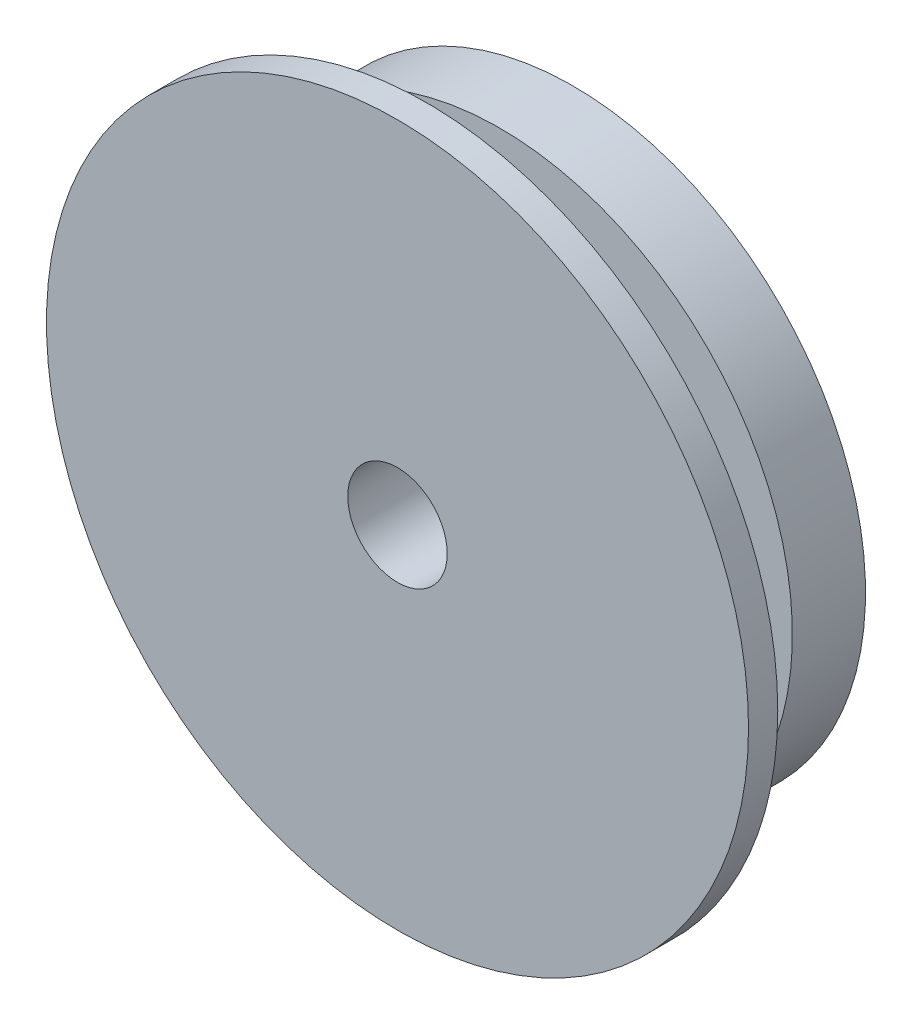
ISO-10303-21;
HEADER;
FILE_DESCRIPTION(('STEP AP214'),'2;1');
FILE_NAME('part.step','',(''),(''),'','','');
FILE_SCHEMA(('AUTOMOTIVE_DESIGN { 1 0 10303 214 1 1 1 1 }'));
ENDSEC;
DATA;
#1=APPLICATION_CONTEXT('core data for automotive mechanical design processes');
#2=APPLICATION_PROTOCOL_DEFINITION('international standard','automotive_design',2000,#1);
#3=PRODUCT_CONTEXT('',#1,'mechanical');
#4=PRODUCT('Part','Part','',(#3));
#5=PRODUCT_RELATED_PRODUCT_CATEGORY('part','',(#4));
#6=PRODUCT_DEFINITION_FORMATION('','',#4);
#7=PRODUCT_DEFINITION_CONTEXT('part definition',#1,'design');
#8=PRODUCT_DEFINITION('design','',#6,#7);
#9=PRODUCT_DEFINITION_SHAPE('','',#8);
#10=(LENGTH_UNIT() NAMED_UNIT(*) SI_UNIT(.MILLI.,.METRE.));
#11=(NAMED_UNIT(*) PLANE_ANGLE_UNIT() SI_UNIT($,.RADIAN.));
#12=(NAMED_UNIT(*) SI_UNIT($,.STERADIAN.) SOLID_ANGLE_UNIT());
#13=UNCERTAINTY_MEASURE_WITH_UNIT(LENGTH_MEASURE(1.E-05),#10,'distance_accuracy_value','');
#14=(GEOMETRIC_REPRESENTATION_CONTEXT(3) GLOBAL_UNCERTAINTY_ASSIGNED_CONTEXT((#13)) GLOBAL_UNIT_ASSIGNED_CONTEXT((#10,
#11,#12)) REPRESENTATION_CONTEXT('',''));
#15=CARTESIAN_POINT('',(0.,0.,0.));
#16=DIRECTION('',(0.,0.,1.));
#17=DIRECTION('',(1.,0.,0.));
#18=AXIS2_PLACEMENT_3D('',#15,#16,#17);
#19=CARTESIAN_POINT('',(0.,0.,16.5));
#20=DIRECTION('',(0.,0.,-1.));
#21=DIRECTION('',(-1.,0.,0.));
#22=AXIS2_PLACEMENT_3D('',#19,#20,#21);
#23=CYLINDRICAL_SURFACE('',#22,25.);
#24=CARTESIAN_POINT('',(0.,0.,7.75));
#25=DIRECTION('',(0.,0.,-1.));
#26=DIRECTION('',(-1.,0.,0.));
#27=AXIS2_PLACEMENT_3D('',#24,#25,#26);
#28=CIRCLE('',#27,25.);
#29=CARTESIAN_POINT('',(-25.,0.,7.75));
#30=VERTEX_POINT('',#29);
#31=EDGE_CURVE('E97',#30,#30,#28,.T.);
#32=ORIENTED_EDGE('',*,*,#31,.T.);
#33=EDGE_LOOP('',(#32));
#34=FACE_BOUND('',#33,.T.);
#35=CARTESIAN_POINT('',(0.,0.,1.5));
#36=DIRECTION('',(0.,0.,-1.));
#37=DIRECTION('',(-1.,0.,0.));
#38=AXIS2_PLACEMENT_3D('',#35,#36,#37);
#39=CIRCLE('',#38,25.);
#40=CARTESIAN_POINT('',(-25.,0.,1.5));
#41=VERTEX_POINT('',#40);
#42=EDGE_CURVE('E83',#41,#41,#39,.T.);
#43=ORIENTED_EDGE('',*,*,#42,.F.);
#44=EDGE_LOOP('',(#43));
#45=FACE_BOUND('',#44,.T.);
#46=ADVANCED_FACE('F39',(#34,#45),#23,.T.);
#47=CARTESIAN_POINT('',(0.,0.,0.));
#48=DIRECTION('',(0.,0.,1.));
#49=DIRECTION('',(1.,0.,0.));
#50=AXIS2_PLACEMENT_3D('',#47,#48,#49);
#51=PLANE('',#50);
#52=CARTESIAN_POINT('',(0.,0.,0.));
#53=DIRECTION('',(0.,0.,1.));
#54=DIRECTION('',(1.,0.,0.));
#55=AXIS2_PLACEMENT_3D('',#52,#53,#54);
#56=CIRCLE('',#55,6.1);
#57=CARTESIAN_POINT('',(6.1,0.,0.));
#58=VERTEX_POINT('',#57);
#59=EDGE_CURVE('E10',#58,#58,#56,.F.);
#60=ORIENTED_EDGE('',*,*,#59,.F.);
#61=EDGE_LOOP('',(#60));
#62=FACE_BOUND('',#61,.T.);
#63=CARTESIAN_POINT('',(0.,0.,0.));
#64=DIRECTION('',(0.,0.,-1.));
#65=DIRECTION('',(-1.,0.,0.));
#66=AXIS2_PLACEMENT_3D('',#63,#64,#65);
#67=CIRCLE('',#66,15.);
#68=CARTESIAN_POINT('',(-15.,0.,0.));
#69=VERTEX_POINT('',#68);
#70=EDGE_CURVE('E59',#69,#69,#67,.T.);
#71=ORIENTED_EDGE('',*,*,#70,.T.);
#72=EDGE_LOOP('',(#71));
#73=FACE_BOUND('',#72,.T.);
#74=ADVANCED_FACE('F129',(#62,#73),#51,.F.);
#75=CARTESIAN_POINT('',(0.,0.,14.));
#76=DIRECTION('',(0.,0.,1.));
#77=DIRECTION('',(1.,0.,0.));
#78=AXIS2_PLACEMENT_3D('',#75,#76,#77);
#79=CIRCLE('',#78,25.);
#80=CARTESIAN_POINT('',(25.,0.,14.));
#81=VERTEX_POINT('',#80);
#82=EDGE_CURVE('E47',#81,#81,#79,.T.);
#83=ORIENTED_EDGE('',*,*,#82,.F.);
#84=EDGE_LOOP('',(#83));
#85=FACE_BOUND('',#84,.T.);
#86=CARTESIAN_POINT('',(0.,0.,11.75));
#87=DIRECTION('',(0.,0.,-1.));
#88=DIRECTION('',(-1.,0.,0.));
#89=AXIS2_PLACEMENT_3D('',#86,#87,#88);
#90=CIRCLE('',#89,25.);
#91=CARTESIAN_POINT('',(-25.,0.,11.75));
#92=VERTEX_POINT('',#91);
#93=EDGE_CURVE('E95',#92,#92,#90,.T.);
#94=ORIENTED_EDGE('',*,*,#93,.F.);
#95=EDGE_LOOP('',(#94));
#96=FACE_BOUND('',#95,.T.);
#97=ADVANCED_FACE('F125',(#85,#96),#23,.T.);
#98=CARTESIAN_POINT('',(0.,0.,16.5));
#99=DIRECTION('',(0.,0.,1.));
#100=DIRECTION('',(1.,0.,0.));
#101=AXIS2_PLACEMENT_3D('',#98,#99,#100);
#102=PLANE('',#101);
#103=CARTESIAN_POINT('',(0.,0.,16.5));
#104=DIRECTION('',(0.,0.,1.));
#105=DIRECTION('',(1.,0.,0.));
#106=AXIS2_PLACEMENT_3D('',#103,#104,#105);
#107=CIRCLE('',#106,4.25);
#108=CARTESIAN_POINT('',(4.25,0.,16.5));
#109=VERTEX_POINT('',#108);
#110=EDGE_CURVE('E56',#109,#109,#107,.T.);
#111=ORIENTED_EDGE('',*,*,#110,.F.);
#112=EDGE_LOOP('',(#111));
#113=FACE_BOUND('',#112,.T.);
#114=CARTESIAN_POINT('',(0.,0.,16.5));
#115=DIRECTION('',(0.,0.,1.));
#116=DIRECTION('',(1.,0.,0.));
#117=AXIS2_PLACEMENT_3D('',#114,#115,#116);
#118=CIRCLE('',#117,30.);
#119=CARTESIAN_POINT('',(30.,0.,16.5));
#120=VERTEX_POINT('',#119);
#121=EDGE_CURVE('E101',#120,#120,#118,.T.);
#122=ORIENTED_EDGE('',*,*,#121,.T.);
#123=EDGE_LOOP('',(#122));
#124=FACE_BOUND('',#123,.T.);
#125=ADVANCED_FACE('F111',(#113,#124),#102,.T.);
#126=CARTESIAN_POINT('',(0.,0.,14.));
#127=DIRECTION('',(0.,0.,1.));
#128=DIRECTION('',(1.,0.,0.));
#129=AXIS2_PLACEMENT_3D('',#126,#127,#128);
#130=CYLINDRICAL_SURFACE('',#129,30.);
#131=CARTESIAN_POINT('',(0.,0.,14.));
#132=DIRECTION('',(0.,0.,1.));
#133=DIRECTION('',(1.,0.,0.));
#134=AXIS2_PLACEMENT_3D('',#131,#132,#133);
#135=CIRCLE('',#134,30.);
#136=CARTESIAN_POINT('',(30.,0.,14.));
#137=VERTEX_POINT('',#136);
#138=EDGE_CURVE('E53',#137,#137,#135,.T.);
#139=ORIENTED_EDGE('',*,*,#138,.T.);
#140=EDGE_LOOP('',(#139));
#141=FACE_BOUND('',#140,.T.);
#142=ORIENTED_EDGE('',*,*,#121,.F.);
#143=EDGE_LOOP('',(#142));
#144=FACE_BOUND('',#143,.T.);
#145=ADVANCED_FACE('F113',(#141,#144),#130,.T.);
#146=CARTESIAN_POINT('',(0.,0.,14.));
#147=DIRECTION('',(0.,0.,1.));
#148=DIRECTION('',(1.,0.,0.));
#149=AXIS2_PLACEMENT_3D('',#146,#147,#148);
#150=PLANE('',#149);
#151=ORIENTED_EDGE('',*,*,#82,.T.);
#152=EDGE_LOOP('',(#151));
#153=FACE_BOUND('',#152,.T.);
#154=ORIENTED_EDGE('',*,*,#138,.F.);
#155=EDGE_LOOP('',(#154));
#156=FACE_BOUND('',#155,.T.);
#157=ADVANCED_FACE('F115',(#153,#156),#150,.F.);
#158=CARTESIAN_POINT('',(0.,0.,7.75));
#159=DIRECTION('',(0.,0.,-1.));
#160=DIRECTION('',(-1.,0.,0.));
#161=AXIS2_PLACEMENT_3D('',#158,#159,#160);
#162=PLANE('',#161);
#163=ORIENTED_EDGE('',*,*,#31,.F.);
#164=EDGE_LOOP('',(#163));
#165=FACE_BOUND('',#164,.T.);
#166=CARTESIAN_POINT('',(0.,0.,7.75));
#167=DIRECTION('',(0.,0.,-1.));
#168=DIRECTION('',(-1.,0.,0.));
#169=AXIS2_PLACEMENT_3D('',#166,#167,#168);
#170=CIRCLE('',#169,19.);
#171=CARTESIAN_POINT('',(-19.,0.,7.75));
#172=VERTEX_POINT('',#171);
#173=EDGE_CURVE('E88',#172,#172,#170,.T.);
#174=ORIENTED_EDGE('',*,*,#173,.T.);
#175=EDGE_LOOP('',(#174));
#176=FACE_BOUND('',#175,.T.);
#177=ADVANCED_FACE('F122',(#165,#176),#162,.F.);
#178=CARTESIAN_POINT('',(0.,0.,11.75));
#179=DIRECTION('',(0.,0.,-1.));
#180=DIRECTION('',(-1.,0.,0.));
#181=AXIS2_PLACEMENT_3D('',#178,#179,#180);
#182=PLANE('',#181);
#183=ORIENTED_EDGE('',*,*,#93,.T.);
#184=EDGE_LOOP('',(#183));
#185=FACE_BOUND('',#184,.T.);
#186=CARTESIAN_POINT('',(0.,0.,11.75));
#187=DIRECTION('',(0.,0.,-1.));
#188=DIRECTION('',(-1.,0.,0.));
#189=AXIS2_PLACEMENT_3D('',#186,#187,#188);
#190=CIRCLE('',#189,19.);
#191=CARTESIAN_POINT('',(-19.,0.,11.75));
#192=VERTEX_POINT('',#191);
#193=EDGE_CURVE('E82',#192,#192,#190,.T.);
#194=ORIENTED_EDGE('',*,*,#193,.F.);
#195=EDGE_LOOP('',(#194));
#196=FACE_BOUND('',#195,.T.);
#197=ADVANCED_FACE('F144',(#185,#196),#182,.T.);
#198=CARTESIAN_POINT('',(0.,0.,7.75));
#199=DIRECTION('',(0.,0.,1.));
#200=DIRECTION('',(1.,0.,0.));
#201=AXIS2_PLACEMENT_3D('',#198,#199,#200);
#202=CYLINDRICAL_SURFACE('',#201,19.);
#203=ORIENTED_EDGE('',*,*,#173,.F.);
#204=EDGE_LOOP('',(#203));
#205=FACE_BOUND('',#204,.T.);
#206=ORIENTED_EDGE('',*,*,#193,.T.);
#207=EDGE_LOOP('',(#206));
#208=FACE_BOUND('',#207,.T.);
#209=ADVANCED_FACE('F147',(#205,#208),#202,.T.);
#210=CARTESIAN_POINT('',(0.,0.,16.5));
#211=DIRECTION('',(0.,0.,-1.));
#212=DIRECTION('',(-1.,0.,0.));
#213=AXIS2_PLACEMENT_3D('',#210,#211,#212);
#214=CYLINDRICAL_SURFACE('',#213,4.25);
#215=ORIENTED_EDGE('',*,*,#110,.T.);
#216=EDGE_LOOP('',(#215));
#217=FACE_BOUND('',#216,.T.);
#218=CARTESIAN_POINT('',(0.,0.,-2.));
#219=DIRECTION('',(0.,0.,-1.));
#220=DIRECTION('',(-1.,0.,0.));
#221=AXIS2_PLACEMENT_3D('',#218,#219,#220);
#222=CIRCLE('',#221,4.25);
#223=CARTESIAN_POINT('',(-4.25,0.,-2.));
#224=VERTEX_POINT('',#223);
#225=EDGE_CURVE('E42',#224,#224,#222,.T.);
#226=ORIENTED_EDGE('',*,*,#225,.T.);
#227=EDGE_LOOP('',(#226));
#228=FACE_BOUND('',#227,.T.);
#229=ADVANCED_FACE('F70',(#217,#228),#214,.F.);
#230=CARTESIAN_POINT('',(0.,0.,-2.));
#231=DIRECTION('',(0.,0.,-1.));
#232=DIRECTION('',(-1.,0.,0.));
#233=AXIS2_PLACEMENT_3D('',#230,#231,#232);
#234=PLANE('',#233);
#235=ORIENTED_EDGE('',*,*,#225,.F.);
#236=EDGE_LOOP('',(#235));
#237=FACE_BOUND('',#236,.T.);
#238=CARTESIAN_POINT('',(0.,0.,-2.));
#239=DIRECTION('',(0.,0.,-1.));
#240=DIRECTION('',(-1.,0.,0.));
#241=AXIS2_PLACEMENT_3D('',#238,#239,#240);
#242=CIRCLE('',#241,6.1);
#243=CARTESIAN_POINT('',(-6.1,0.,-2.));
#244=VERTEX_POINT('',#243);
#245=EDGE_CURVE('E79',#244,#244,#242,.T.);
#246=ORIENTED_EDGE('',*,*,#245,.T.);
#247=EDGE_LOOP('',(#246));
#248=FACE_BOUND('',#247,.T.);
#249=ADVANCED_FACE('F72',(#237,#248),#234,.T.);
#250=CARTESIAN_POINT('',(0.,0.,-2.));
#251=DIRECTION('',(0.,0.,1.));
#252=DIRECTION('',(1.,0.,0.));
#253=AXIS2_PLACEMENT_3D('',#250,#251,#252);
#254=CYLINDRICAL_SURFACE('',#253,6.1);
#255=ORIENTED_EDGE('',*,*,#245,.F.);
#256=EDGE_LOOP('',(#255));
#257=FACE_BOUND('',#256,.T.);
#258=ORIENTED_EDGE('',*,*,#59,.T.);
#259=EDGE_LOOP('',(#258));
#260=FACE_BOUND('',#259,.T.);
#261=ADVANCED_FACE('F75',(#257,#260),#254,.T.);
#262=CARTESIAN_POINT('',(0.,0.,1.5));
#263=DIRECTION('',(0.,0.,-1.));
#264=DIRECTION('',(-1.,0.,0.));
#265=AXIS2_PLACEMENT_3D('',#262,#263,#264);
#266=PLANE('',#265);
#267=CARTESIAN_POINT('',(0.,0.,1.5));
#268=DIRECTION('',(0.,0.,-1.));
#269=DIRECTION('',(-1.,0.,0.));
#270=AXIS2_PLACEMENT_3D('',#267,#268,#269);
#271=CIRCLE('',#270,15.);
#272=CARTESIAN_POINT('',(-15.,0.,1.5));
#273=VERTEX_POINT('',#272);
#274=EDGE_CURVE('E65',#273,#273,#271,.T.);
#275=ORIENTED_EDGE('',*,*,#274,.F.);
#276=EDGE_LOOP('',(#275));
#277=FACE_BOUND('',#276,.T.);
#278=ORIENTED_EDGE('',*,*,#42,.T.);
#279=EDGE_LOOP('',(#278));
#280=FACE_BOUND('',#279,.T.);
#281=ADVANCED_FACE('F186',(#277,#280),#266,.T.);
#282=CARTESIAN_POINT('',(0.,0.,1.5));
#283=DIRECTION('',(0.,0.,-1.));
#284=DIRECTION('',(-1.,0.,0.));
#285=AXIS2_PLACEMENT_3D('',#282,#283,#284);
#286=CYLINDRICAL_SURFACE('',#285,15.);
#287=ORIENTED_EDGE('',*,*,#274,.T.);
#288=EDGE_LOOP('',(#287));
#289=FACE_BOUND('',#288,.T.);
#290=ORIENTED_EDGE('',*,*,#70,.F.);
#291=EDGE_LOOP('',(#290));
#292=FACE_BOUND('',#291,.T.);
#293=ADVANCED_FACE('F207',(#289,#292),#286,.T.);
#294=CLOSED_SHELL('',(#46,#74,#97,#125,#145,#157,#177,#197,#209,#229,#249,#261,#281,#293));
#295=MANIFOLD_SOLID_BREP('B2',#294);
#296=ADVANCED_BREP_SHAPE_REPRESENTATION('',(#18,#295),#14);
#297=SHAPE_DEFINITION_REPRESENTATION(#9,#296);
ENDSEC;
END-ISO-10303-21;
